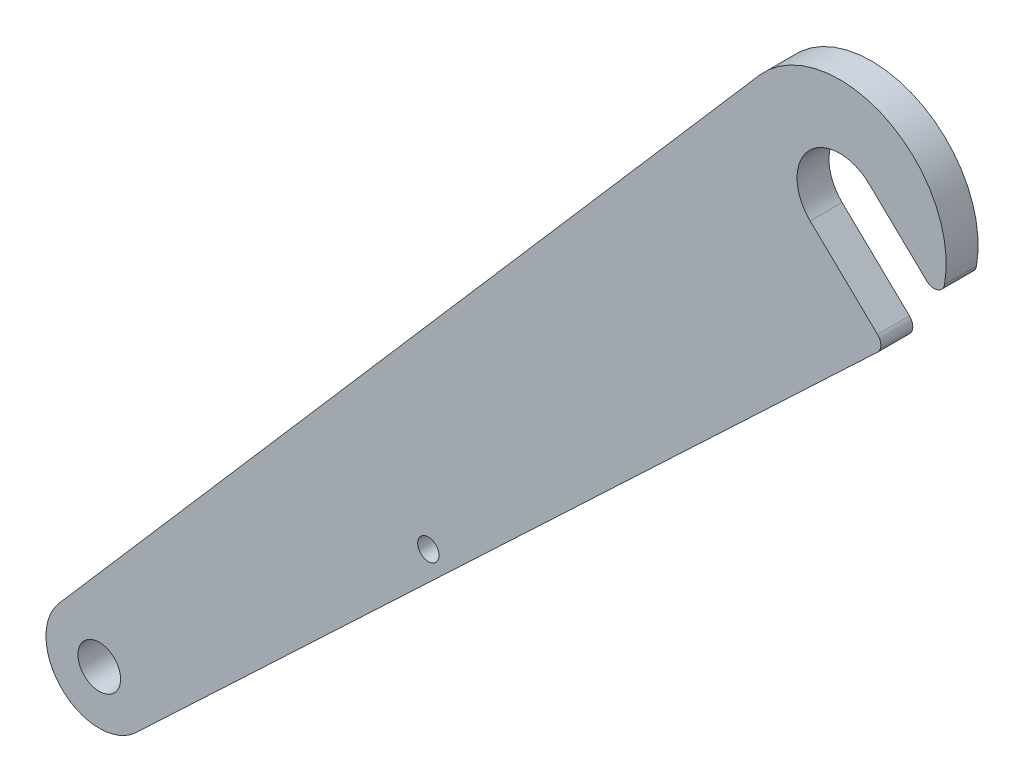
ISO-10303-21;
HEADER;
FILE_DESCRIPTION(('STEP AP214'),'2;1');
FILE_NAME('part.step','',(''),(''),'','','');
FILE_SCHEMA(('AUTOMOTIVE_DESIGN { 1 0 10303 214 1 1 1 1 }'));
ENDSEC;
DATA;
#1=APPLICATION_CONTEXT('core data for automotive mechanical design processes');
#2=APPLICATION_PROTOCOL_DEFINITION('international standard','automotive_design',2000,#1);
#3=PRODUCT_CONTEXT('',#1,'mechanical');
#4=PRODUCT('Part','Part','',(#3));
#5=PRODUCT_RELATED_PRODUCT_CATEGORY('part','',(#4));
#6=PRODUCT_DEFINITION_FORMATION('','',#4);
#7=PRODUCT_DEFINITION_CONTEXT('part definition',#1,'design');
#8=PRODUCT_DEFINITION('design','',#6,#7);
#9=PRODUCT_DEFINITION_SHAPE('','',#8);
#10=(LENGTH_UNIT() NAMED_UNIT(*) SI_UNIT(.MILLI.,.METRE.));
#11=(NAMED_UNIT(*) PLANE_ANGLE_UNIT() SI_UNIT($,.RADIAN.));
#12=(NAMED_UNIT(*) SI_UNIT($,.STERADIAN.) SOLID_ANGLE_UNIT());
#13=UNCERTAINTY_MEASURE_WITH_UNIT(LENGTH_MEASURE(1.E-05),#10,'distance_accuracy_value','');
#14=(GEOMETRIC_REPRESENTATION_CONTEXT(3) GLOBAL_UNCERTAINTY_ASSIGNED_CONTEXT((#13)) GLOBAL_UNIT_ASSIGNED_CONTEXT((#10,
#11,#12)) REPRESENTATION_CONTEXT('',''));
#15=CARTESIAN_POINT('',(0.,0.,0.));
#16=DIRECTION('',(0.,0.,1.));
#17=DIRECTION('',(1.,0.,0.));
#18=AXIS2_PLACEMENT_3D('',#15,#16,#17);
#19=CARTESIAN_POINT('',(69.5,72.5,3.));
#20=DIRECTION('',(0.,0.,1.));
#21=DIRECTION('',(1.,0.,0.));
#22=AXIS2_PLACEMENT_3D('',#19,#20,#21);
#23=PLANE('',#22);
#24=CARTESIAN_POINT('',(0.,0.,3.));
#25=DIRECTION('',(0.,0.,1.));
#26=DIRECTION('',(1.,0.,0.));
#27=AXIS2_PLACEMENT_3D('',#24,#25,#26);
#28=CIRCLE('',#27,2.);
#29=CARTESIAN_POINT('',(2.,0.,3.));
#30=VERTEX_POINT('',#29);
#31=EDGE_CURVE('E187',#30,#30,#28,.T.);
#32=ORIENTED_EDGE('',*,*,#31,.F.);
#33=EDGE_LOOP('',(#32));
#34=FACE_BOUND('',#33,.T.);
#35=DIRECTION('',(0.721884571833893,-0.692013486102833,0.));
#36=VECTOR('',#35,1.);
#37=CARTESIAN_POINT('',(72.2680539444113,75.3875382873356,3.));
#38=LINE('',#37,#36);
#39=CARTESIAN_POINT('',(72.2680539444113,75.3875382873356,3.));
#40=VERTEX_POINT('',#39);
#41=CARTESIAN_POINT('',(77.6701434256122,70.2089835432878,3.));
#42=VERTEX_POINT('',#41);
#43=EDGE_CURVE('E106',#40,#42,#38,.T.);
#44=ORIENTED_EDGE('',*,*,#43,.T.);
#45=CARTESIAN_POINT('',(78.362156911715,70.9308681151217,3.));
#46=DIRECTION('',(0.,0.,1.));
#47=DIRECTION('',(1.,0.,0.));
#48=AXIS2_PLACEMENT_3D('',#45,#46,#47);
#49=CIRCLE('',#48,1.);
#50=CARTESIAN_POINT('',(79.3468410130167,70.756520127913,3.));
#51=VERTEX_POINT('',#50);
#52=EDGE_CURVE('E146',#42,#51,#49,.T.);
#53=ORIENTED_EDGE('',*,*,#52,.T.);
#54=CARTESIAN_POINT('',(69.5,72.5,3.));
#55=DIRECTION('',(0.,0.,1.));
#56=DIRECTION('',(-1.,0.,0.));
#57=AXIS2_PLACEMENT_3D('',#54,#55,#56);
#58=CIRCLE('',#57,10.);
#59=CARTESIAN_POINT('',(61.9455861018622,79.0521622885596,3.));
#60=VERTEX_POINT('',#59);
#61=EDGE_CURVE('E116',#51,#60,#58,.T.);
#62=ORIENTED_EDGE('',*,*,#61,.T.);
#63=DIRECTION('',(-0.655216228855964,-0.755441389813776,0.));
#64=VECTOR('',#63,1.);
#65=CARTESIAN_POINT('',(-3.77720694906888,3.27608114427983,3.));
#66=LINE('',#65,#64);
#67=CARTESIAN_POINT('',(-3.77720694906888,3.27608114427982,3.));
#68=VERTEX_POINT('',#67);
#69=EDGE_CURVE('E192',#60,#68,#66,.T.);
#70=ORIENTED_EDGE('',*,*,#69,.T.);
#71=CARTESIAN_POINT('',(0.,0.,3.));
#72=DIRECTION('',(0.,0.,1.));
#73=DIRECTION('',(1.,0.,0.));
#74=AXIS2_PLACEMENT_3D('',#71,#72,#73);
#75=CIRCLE('',#74,5.);
#76=CARTESIAN_POINT('',(3.43268704622845,-3.63547240983279,3.));
#77=VERTEX_POINT('',#76);
#78=EDGE_CURVE('E175',#68,#77,#75,.T.);
#79=ORIENTED_EDGE('',*,*,#78,.T.);
#80=DIRECTION('',(0.727094481966557,0.686537409245689,0.));
#81=VECTOR('',#80,1.);
#82=CARTESIAN_POINT('',(73.8158196186501,62.8217139522124,3.));
#83=LINE('',#82,#81);
#84=CARTESIAN_POINT('',(73.0515789380497,62.1001023461383,3.));
#85=VERTEX_POINT('',#84);
#86=EDGE_CURVE('E189',#77,#85,#83,.T.);
#87=ORIENTED_EDGE('',*,*,#86,.T.);
#88=CARTESIAN_POINT('',(72.365041528804,62.8271968281049,3.));
#89=DIRECTION('',(0.,0.,1.));
#90=DIRECTION('',(1.,0.,0.));
#91=AXIS2_PLACEMENT_3D('',#88,#89,#90);
#92=CIRCLE('',#91,1.);
#93=CARTESIAN_POINT('',(73.0570550149068,63.5490813999387,3.));
#94=VERTEX_POINT('',#93);
#95=EDGE_CURVE('E50',#85,#94,#92,.T.);
#96=ORIENTED_EDGE('',*,*,#95,.T.);
#97=DIRECTION('',(-0.721884571833892,0.692013486102834,0.));
#98=VECTOR('',#97,1.);
#99=CARTESIAN_POINT('',(66.7319460555887,69.6124617126644,3.));
#100=LINE('',#99,#98);
#101=CARTESIAN_POINT('',(66.7319460555887,69.6124617126644,3.));
#102=VERTEX_POINT('',#101);
#103=EDGE_CURVE('E121',#94,#102,#100,.T.);
#104=ORIENTED_EDGE('',*,*,#103,.T.);
#105=CARTESIAN_POINT('',(69.5,72.5,3.));
#106=DIRECTION('',(0.,0.,-1.));
#107=DIRECTION('',(1.,0.,0.));
#108=AXIS2_PLACEMENT_3D('',#105,#106,#107);
#109=CIRCLE('',#108,3.99999999999999);
#110=EDGE_CURVE('E117',#102,#40,#109,.T.);
#111=ORIENTED_EDGE('',*,*,#110,.T.);
#112=EDGE_LOOP('',(#44,#53,#62,#70,#79,#87,#96,#104,#111));
#113=FACE_BOUND('',#112,.T.);
#114=CARTESIAN_POINT('',(30.8918323270417,25.,3.));
#115=DIRECTION('',(0.,0.,1.));
#116=DIRECTION('',(1.,0.,0.));
#117=AXIS2_PLACEMENT_3D('',#114,#115,#116);
#118=CIRCLE('',#117,0.999999999999998);
#119=CARTESIAN_POINT('',(31.8918323270417,25.,3.));
#120=VERTEX_POINT('',#119);
#121=EDGE_CURVE('E198',#120,#120,#118,.T.);
#122=ORIENTED_EDGE('',*,*,#121,.F.);
#123=EDGE_LOOP('',(#122));
#124=FACE_BOUND('',#123,.T.);
#125=ADVANCED_FACE('F35',(#34,#113,#124),#23,.T.);
#126=CARTESIAN_POINT('',(69.5,72.5,0.));
#127=DIRECTION('',(0.,0.,1.));
#128=DIRECTION('',(1.,0.,0.));
#129=AXIS2_PLACEMENT_3D('',#126,#127,#128);
#130=PLANE('',#129);
#131=CARTESIAN_POINT('',(69.5,72.5,0.));
#132=DIRECTION('',(0.,0.,1.));
#133=DIRECTION('',(-1.,0.,0.));
#134=AXIS2_PLACEMENT_3D('',#131,#132,#133);
#135=CIRCLE('',#134,10.);
#136=CARTESIAN_POINT('',(79.3468410130167,70.756520127913,0.));
#137=VERTEX_POINT('',#136);
#138=CARTESIAN_POINT('',(61.9455861018622,79.0521622885596,0.));
#139=VERTEX_POINT('',#138);
#140=EDGE_CURVE('E180',#137,#139,#135,.T.);
#141=ORIENTED_EDGE('',*,*,#140,.F.);
#142=CARTESIAN_POINT('',(78.362156911715,70.9308681151217,0.));
#143=DIRECTION('',(0.,0.,1.));
#144=DIRECTION('',(1.,0.,0.));
#145=AXIS2_PLACEMENT_3D('',#142,#143,#144);
#146=CIRCLE('',#145,1.);
#147=CARTESIAN_POINT('',(77.6701434256122,70.2089835432878,0.));
#148=VERTEX_POINT('',#147);
#149=EDGE_CURVE('E142',#137,#148,#146,.F.);
#150=ORIENTED_EDGE('',*,*,#149,.T.);
#151=DIRECTION('',(0.721884571833893,-0.692013486102833,0.));
#152=VECTOR('',#151,1.);
#153=CARTESIAN_POINT('',(72.2680539444113,75.3875382873356,0.));
#154=LINE('',#153,#152);
#155=CARTESIAN_POINT('',(72.2680539444113,75.3875382873356,0.));
#156=VERTEX_POINT('',#155);
#157=EDGE_CURVE('E184',#156,#148,#154,.T.);
#158=ORIENTED_EDGE('',*,*,#157,.F.);
#159=CARTESIAN_POINT('',(69.5,72.5,0.));
#160=DIRECTION('',(0.,0.,-1.));
#161=DIRECTION('',(1.,0.,0.));
#162=AXIS2_PLACEMENT_3D('',#159,#160,#161);
#163=CIRCLE('',#162,3.99999999999999);
#164=CARTESIAN_POINT('',(66.7319460555887,69.6124617126644,0.));
#165=VERTEX_POINT('',#164);
#166=EDGE_CURVE('E129',#165,#156,#163,.T.);
#167=ORIENTED_EDGE('',*,*,#166,.F.);
#168=DIRECTION('',(-0.721884571833892,0.692013486102834,0.));
#169=VECTOR('',#168,1.);
#170=CARTESIAN_POINT('',(66.7319460555887,69.6124617126644,0.));
#171=LINE('',#170,#169);
#172=CARTESIAN_POINT('',(73.0570550149068,63.5490813999387,0.));
#173=VERTEX_POINT('',#172);
#174=EDGE_CURVE('E125',#173,#165,#171,.T.);
#175=ORIENTED_EDGE('',*,*,#174,.F.);
#176=CARTESIAN_POINT('',(72.365041528804,62.8271968281049,0.));
#177=DIRECTION('',(0.,0.,1.));
#178=DIRECTION('',(1.,0.,0.));
#179=AXIS2_PLACEMENT_3D('',#176,#177,#178);
#180=CIRCLE('',#179,1.);
#181=CARTESIAN_POINT('',(73.0515789380497,62.1001023461383,0.));
#182=VERTEX_POINT('',#181);
#183=EDGE_CURVE('E134',#173,#182,#180,.F.);
#184=ORIENTED_EDGE('',*,*,#183,.T.);
#185=DIRECTION('',(0.727094481966557,0.686537409245689,0.));
#186=VECTOR('',#185,1.);
#187=CARTESIAN_POINT('',(73.8158196186501,62.8217139522124,0.));
#188=LINE('',#187,#186);
#189=CARTESIAN_POINT('',(3.43268704622845,-3.63547240983279,0.));
#190=VERTEX_POINT('',#189);
#191=EDGE_CURVE('E158',#190,#182,#188,.T.);
#192=ORIENTED_EDGE('',*,*,#191,.F.);
#193=CARTESIAN_POINT('',(0.,0.,0.));
#194=DIRECTION('',(0.,0.,1.));
#195=DIRECTION('',(1.,0.,0.));
#196=AXIS2_PLACEMENT_3D('',#193,#194,#195);
#197=CIRCLE('',#196,5.);
#198=CARTESIAN_POINT('',(-3.77720694906888,3.27608114427982,0.));
#199=VERTEX_POINT('',#198);
#200=EDGE_CURVE('E160',#199,#190,#197,.T.);
#201=ORIENTED_EDGE('',*,*,#200,.F.);
#202=DIRECTION('',(-0.655216228855964,-0.755441389813776,0.));
#203=VECTOR('',#202,1.);
#204=CARTESIAN_POINT('',(-3.77720694906888,3.27608114427983,0.));
#205=LINE('',#204,#203);
#206=EDGE_CURVE('E179',#139,#199,#205,.T.);
#207=ORIENTED_EDGE('',*,*,#206,.F.);
#208=EDGE_LOOP('',(#141,#150,#158,#167,#175,#184,#192,#201,#207));
#209=FACE_BOUND('',#208,.T.);
#210=CARTESIAN_POINT('',(0.,0.,0.));
#211=DIRECTION('',(0.,0.,1.));
#212=DIRECTION('',(1.,0.,0.));
#213=AXIS2_PLACEMENT_3D('',#210,#211,#212);
#214=CIRCLE('',#213,2.);
#215=CARTESIAN_POINT('',(2.,0.,0.));
#216=VERTEX_POINT('',#215);
#217=EDGE_CURVE('E195',#216,#216,#214,.T.);
#218=ORIENTED_EDGE('',*,*,#217,.T.);
#219=EDGE_LOOP('',(#218));
#220=FACE_BOUND('',#219,.T.);
#221=CARTESIAN_POINT('',(30.8918323270417,25.,0.));
#222=DIRECTION('',(0.,0.,1.));
#223=DIRECTION('',(1.,0.,0.));
#224=AXIS2_PLACEMENT_3D('',#221,#222,#223);
#225=CIRCLE('',#224,0.999999999999998);
#226=CARTESIAN_POINT('',(31.8918323270417,25.,0.));
#227=VERTEX_POINT('',#226);
#228=EDGE_CURVE('E201',#227,#227,#225,.T.);
#229=ORIENTED_EDGE('',*,*,#228,.T.);
#230=EDGE_LOOP('',(#229));
#231=FACE_BOUND('',#230,.T.);
#232=ADVANCED_FACE('F155',(#209,#220,#231),#130,.F.);
#233=CARTESIAN_POINT('',(69.5,72.5,3.));
#234=DIRECTION('',(0.,0.,-1.));
#235=DIRECTION('',(-1.,0.,0.));
#236=AXIS2_PLACEMENT_3D('',#233,#234,#235);
#237=CYLINDRICAL_SURFACE('',#236,3.99999999999999);
#238=ORIENTED_EDGE('',*,*,#166,.T.);
#239=DIRECTION('',(0.,0.,-1.));
#240=VECTOR('',#239,1.);
#241=CARTESIAN_POINT('',(72.2680539444113,75.3875382873356,3.));
#242=LINE('',#241,#240);
#243=EDGE_CURVE('E111',#40,#156,#242,.T.);
#244=ORIENTED_EDGE('',*,*,#243,.F.);
#245=ORIENTED_EDGE('',*,*,#110,.F.);
#246=DIRECTION('',(0.,0.,-1.));
#247=VECTOR('',#246,1.);
#248=CARTESIAN_POINT('',(66.7319460555887,69.6124617126644,3.));
#249=LINE('',#248,#247);
#250=EDGE_CURVE('E164',#102,#165,#249,.T.);
#251=ORIENTED_EDGE('',*,*,#250,.T.);
#252=EDGE_LOOP('',(#238,#244,#245,#251));
#253=FACE_BOUND('',#252,.T.);
#254=ADVANCED_FACE('F127',(#253),#237,.F.);
#255=CARTESIAN_POINT('',(72.2680539444113,75.3875382873356,3.));
#256=DIRECTION('',(0.692013486102833,0.721884571833893,0.));
#257=DIRECTION('',(-0.721884571833893,0.692013486102833,0.));
#258=AXIS2_PLACEMENT_3D('',#255,#256,#257);
#259=PLANE('',#258);
#260=ORIENTED_EDGE('',*,*,#157,.T.);
#261=DIRECTION('',(0.,0.,-1.));
#262=VECTOR('',#261,1.);
#263=CARTESIAN_POINT('',(77.6701434256122,70.2089835432878,3.));
#264=LINE('',#263,#262);
#265=EDGE_CURVE('E114',#148,#42,#264,.F.);
#266=ORIENTED_EDGE('',*,*,#265,.T.);
#267=ORIENTED_EDGE('',*,*,#43,.F.);
#268=ORIENTED_EDGE('',*,*,#243,.T.);
#269=EDGE_LOOP('',(#260,#266,#267,#268));
#270=FACE_BOUND('',#269,.T.);
#271=ADVANCED_FACE('F109',(#270),#259,.F.);
#272=CARTESIAN_POINT('',(69.5,72.5,3.));
#273=DIRECTION('',(0.,0.,-1.));
#274=DIRECTION('',(-1.,0.,0.));
#275=AXIS2_PLACEMENT_3D('',#272,#273,#274);
#276=CYLINDRICAL_SURFACE('',#275,10.);
#277=ORIENTED_EDGE('',*,*,#61,.F.);
#278=DIRECTION('',(0.,0.,-1.));
#279=VECTOR('',#278,1.);
#280=CARTESIAN_POINT('',(79.3468410130167,70.756520127913,3.));
#281=LINE('',#280,#279);
#282=EDGE_CURVE('E130',#51,#137,#281,.T.);
#283=ORIENTED_EDGE('',*,*,#282,.T.);
#284=ORIENTED_EDGE('',*,*,#140,.T.);
#285=DIRECTION('',(0.,0.,-1.));
#286=VECTOR('',#285,1.);
#287=CARTESIAN_POINT('',(61.9455861018622,79.0521622885596,3.));
#288=LINE('',#287,#286);
#289=EDGE_CURVE('E131',#60,#139,#288,.T.);
#290=ORIENTED_EDGE('',*,*,#289,.F.);
#291=EDGE_LOOP('',(#277,#283,#284,#290));
#292=FACE_BOUND('',#291,.T.);
#293=ADVANCED_FACE('F231',(#292),#276,.T.);
#294=CARTESIAN_POINT('',(-3.77720694906888,3.27608114427983,3.));
#295=DIRECTION('',(0.755441389813776,-0.655216228855964,0.));
#296=DIRECTION('',(0.655216228855964,0.755441389813776,0.));
#297=AXIS2_PLACEMENT_3D('',#294,#295,#296);
#298=PLANE('',#297);
#299=ORIENTED_EDGE('',*,*,#206,.T.);
#300=DIRECTION('',(0.,0.,-1.));
#301=VECTOR('',#300,1.);
#302=CARTESIAN_POINT('',(-3.77720694906888,3.27608114427982,3.));
#303=LINE('',#302,#301);
#304=EDGE_CURVE('E137',#68,#199,#303,.T.);
#305=ORIENTED_EDGE('',*,*,#304,.F.);
#306=ORIENTED_EDGE('',*,*,#69,.F.);
#307=ORIENTED_EDGE('',*,*,#289,.T.);
#308=EDGE_LOOP('',(#299,#305,#306,#307));
#309=FACE_BOUND('',#308,.T.);
#310=ADVANCED_FACE('F228',(#309),#298,.F.);
#311=CARTESIAN_POINT('',(0.,0.,3.));
#312=DIRECTION('',(0.,0.,-1.));
#313=DIRECTION('',(-1.,0.,0.));
#314=AXIS2_PLACEMENT_3D('',#311,#312,#313);
#315=CYLINDRICAL_SURFACE('',#314,5.);
#316=ORIENTED_EDGE('',*,*,#200,.T.);
#317=DIRECTION('',(0.,0.,-1.));
#318=VECTOR('',#317,1.);
#319=CARTESIAN_POINT('',(3.43268704622845,-3.63547240983279,3.));
#320=LINE('',#319,#318);
#321=EDGE_CURVE('E166',#77,#190,#320,.T.);
#322=ORIENTED_EDGE('',*,*,#321,.F.);
#323=ORIENTED_EDGE('',*,*,#78,.F.);
#324=ORIENTED_EDGE('',*,*,#304,.T.);
#325=EDGE_LOOP('',(#316,#322,#323,#324));
#326=FACE_BOUND('',#325,.T.);
#327=ADVANCED_FACE('F173',(#326),#315,.T.);
#328=CARTESIAN_POINT('',(73.8158196186501,62.8217139522124,3.));
#329=DIRECTION('',(-0.686537409245689,0.727094481966557,0.));
#330=DIRECTION('',(-0.727094481966558,-0.68653740924569,0.));
#331=AXIS2_PLACEMENT_3D('',#328,#329,#330);
#332=PLANE('',#331);
#333=ORIENTED_EDGE('',*,*,#191,.T.);
#334=DIRECTION('',(0.,0.,-1.));
#335=VECTOR('',#334,1.);
#336=CARTESIAN_POINT('',(73.0515789380497,62.1001023461383,3.));
#337=LINE('',#336,#335);
#338=EDGE_CURVE('E11',#182,#85,#337,.F.);
#339=ORIENTED_EDGE('',*,*,#338,.T.);
#340=ORIENTED_EDGE('',*,*,#86,.F.);
#341=ORIENTED_EDGE('',*,*,#321,.T.);
#342=EDGE_LOOP('',(#333,#339,#340,#341));
#343=FACE_BOUND('',#342,.T.);
#344=ADVANCED_FACE('F223',(#343),#332,.F.);
#345=CARTESIAN_POINT('',(66.7319460555887,69.6124617126644,3.));
#346=DIRECTION('',(-0.692013486102834,-0.721884571833892,0.));
#347=DIRECTION('',(0.721884571833892,-0.692013486102834,0.));
#348=AXIS2_PLACEMENT_3D('',#345,#346,#347);
#349=PLANE('',#348);
#350=ORIENTED_EDGE('',*,*,#103,.F.);
#351=DIRECTION('',(0.,0.,-1.));
#352=VECTOR('',#351,1.);
#353=CARTESIAN_POINT('',(73.0570550149068,63.5490813999387,3.));
#354=LINE('',#353,#352);
#355=EDGE_CURVE('E43',#94,#173,#354,.T.);
#356=ORIENTED_EDGE('',*,*,#355,.T.);
#357=ORIENTED_EDGE('',*,*,#174,.T.);
#358=ORIENTED_EDGE('',*,*,#250,.F.);
#359=EDGE_LOOP('',(#350,#356,#357,#358));
#360=FACE_BOUND('',#359,.T.);
#361=ADVANCED_FACE('F151',(#360),#349,.F.);
#362=CARTESIAN_POINT('',(0.,0.,3.));
#363=DIRECTION('',(0.,0.,-1.));
#364=DIRECTION('',(-1.,0.,0.));
#365=AXIS2_PLACEMENT_3D('',#362,#363,#364);
#366=CYLINDRICAL_SURFACE('',#365,2.);
#367=ORIENTED_EDGE('',*,*,#31,.T.);
#368=EDGE_LOOP('',(#367));
#369=FACE_BOUND('',#368,.T.);
#370=ORIENTED_EDGE('',*,*,#217,.F.);
#371=EDGE_LOOP('',(#370));
#372=FACE_BOUND('',#371,.T.);
#373=ADVANCED_FACE('F218',(#369,#372),#366,.F.);
#374=CARTESIAN_POINT('',(30.8918323270417,25.,3.));
#375=DIRECTION('',(0.,0.,-1.));
#376=DIRECTION('',(-1.,0.,0.));
#377=AXIS2_PLACEMENT_3D('',#374,#375,#376);
#378=CYLINDRICAL_SURFACE('',#377,0.999999999999998);
#379=ORIENTED_EDGE('',*,*,#121,.T.);
#380=EDGE_LOOP('',(#379));
#381=FACE_BOUND('',#380,.T.);
#382=ORIENTED_EDGE('',*,*,#228,.F.);
#383=EDGE_LOOP('',(#382));
#384=FACE_BOUND('',#383,.T.);
#385=ADVANCED_FACE('F207',(#381,#384),#378,.F.);
#386=CARTESIAN_POINT('',(78.362156911715,70.9308681151217,3.));
#387=DIRECTION('',(0.,0.,-1.));
#388=DIRECTION('',(-1.,0.,0.));
#389=AXIS2_PLACEMENT_3D('',#386,#387,#388);
#390=CYLINDRICAL_SURFACE('',#389,1.);
#391=ORIENTED_EDGE('',*,*,#52,.F.);
#392=ORIENTED_EDGE('',*,*,#265,.F.);
#393=ORIENTED_EDGE('',*,*,#149,.F.);
#394=ORIENTED_EDGE('',*,*,#282,.F.);
#395=EDGE_LOOP('',(#391,#392,#393,#394));
#396=FACE_BOUND('',#395,.T.);
#397=ADVANCED_FACE('F238',(#396),#390,.T.);
#398=CARTESIAN_POINT('',(72.365041528804,62.8271968281049,3.));
#399=DIRECTION('',(0.,0.,-1.));
#400=DIRECTION('',(-1.,0.,0.));
#401=AXIS2_PLACEMENT_3D('',#398,#399,#400);
#402=CYLINDRICAL_SURFACE('',#401,1.);
#403=ORIENTED_EDGE('',*,*,#95,.F.);
#404=ORIENTED_EDGE('',*,*,#338,.F.);
#405=ORIENTED_EDGE('',*,*,#183,.F.);
#406=ORIENTED_EDGE('',*,*,#355,.F.);
#407=EDGE_LOOP('',(#403,#404,#405,#406));
#408=FACE_BOUND('',#407,.T.);
#409=ADVANCED_FACE('F37',(#408),#402,.T.);
#410=CLOSED_SHELL('',(#125,#232,#254,#271,#293,#310,#327,#344,#361,#373,#385,#397,#409));
#411=MANIFOLD_SOLID_BREP('B2',#410);
#412=ADVANCED_BREP_SHAPE_REPRESENTATION('',(#18,#411),#14);
#413=SHAPE_DEFINITION_REPRESENTATION(#9,#412);
ENDSEC;
END-ISO-10303-21;
